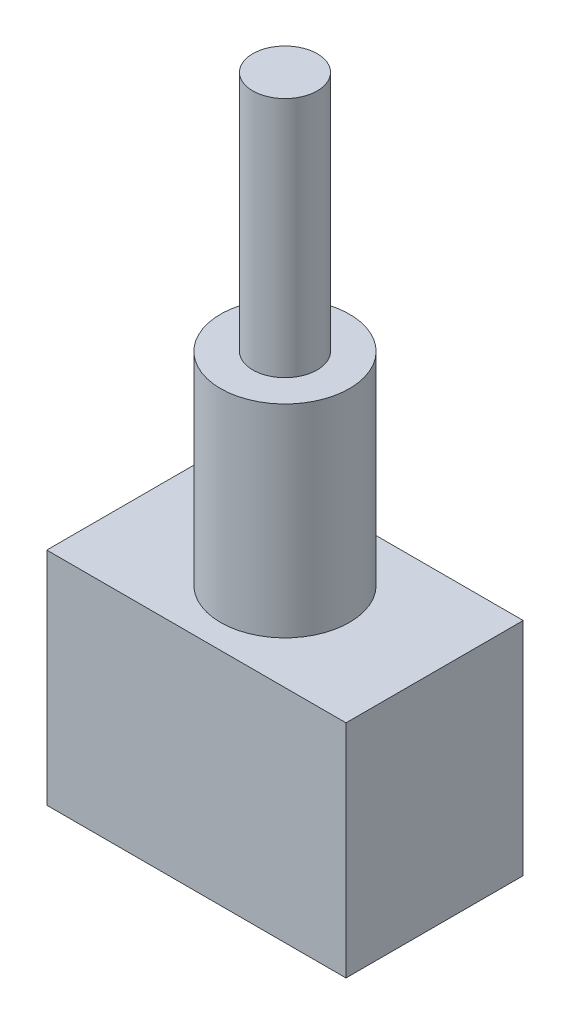
ISO-10303-21;
HEADER;
FILE_DESCRIPTION(('STEP AP214'),'2;1');
FILE_NAME('part.step','',(''),(''),'','','');
FILE_SCHEMA(('AUTOMOTIVE_DESIGN { 1 0 10303 214 1 1 1 1 }'));
ENDSEC;
DATA;
#1=APPLICATION_CONTEXT('core data for automotive mechanical design processes');
#2=APPLICATION_PROTOCOL_DEFINITION('international standard','automotive_design',2000,#1);
#3=PRODUCT_CONTEXT('',#1,'mechanical');
#4=PRODUCT('Part','Part','',(#3));
#5=PRODUCT_RELATED_PRODUCT_CATEGORY('part','',(#4));
#6=PRODUCT_DEFINITION_FORMATION('','',#4);
#7=PRODUCT_DEFINITION_CONTEXT('part definition',#1,'design');
#8=PRODUCT_DEFINITION('design','',#6,#7);
#9=PRODUCT_DEFINITION_SHAPE('','',#8);
#10=(LENGTH_UNIT() NAMED_UNIT(*) SI_UNIT(.MILLI.,.METRE.));
#11=(NAMED_UNIT(*) PLANE_ANGLE_UNIT() SI_UNIT($,.RADIAN.));
#12=(NAMED_UNIT(*) SI_UNIT($,.STERADIAN.) SOLID_ANGLE_UNIT());
#13=UNCERTAINTY_MEASURE_WITH_UNIT(LENGTH_MEASURE(1.E-05),#10,'distance_accuracy_value','');
#14=(GEOMETRIC_REPRESENTATION_CONTEXT(3) GLOBAL_UNCERTAINTY_ASSIGNED_CONTEXT((#13)) GLOBAL_UNIT_ASSIGNED_CONTEXT((#10,
#11,#12)) REPRESENTATION_CONTEXT('',''));
#15=CARTESIAN_POINT('',(0.,0.,0.));
#16=DIRECTION('',(0.,0.,1.));
#17=DIRECTION('',(1.,0.,0.));
#18=AXIS2_PLACEMENT_3D('',#15,#16,#17);
#19=CARTESIAN_POINT('',(0.,0.,7.7));
#20=DIRECTION('',(1.,0.,0.));
#21=DIRECTION('',(0.,0.,-1.));
#22=AXIS2_PLACEMENT_3D('',#19,#20,#21);
#23=PLANE('',#22);
#24=DIRECTION('',(0.,-1.,0.));
#25=VECTOR('',#24,1.);
#26=CARTESIAN_POINT('',(0.,0.,0.));
#27=LINE('',#26,#25);
#28=CARTESIAN_POINT('',(0.,9.6,0.));
#29=VERTEX_POINT('',#28);
#30=CARTESIAN_POINT('',(0.,0.,0.));
#31=VERTEX_POINT('',#30);
#32=EDGE_CURVE('E100',#29,#31,#27,.T.);
#33=ORIENTED_EDGE('',*,*,#32,.T.);
#34=DIRECTION('',(0.,0.,-1.));
#35=VECTOR('',#34,1.);
#36=CARTESIAN_POINT('',(0.,0.,7.7));
#37=LINE('',#36,#35);
#38=CARTESIAN_POINT('',(0.,0.,7.7));
#39=VERTEX_POINT('',#38);
#40=EDGE_CURVE('E36',#39,#31,#37,.T.);
#41=ORIENTED_EDGE('',*,*,#40,.F.);
#42=DIRECTION('',(0.,-1.,0.));
#43=VECTOR('',#42,1.);
#44=CARTESIAN_POINT('',(0.,0.,7.7));
#45=LINE('',#44,#43);
#46=CARTESIAN_POINT('',(0.,9.6,7.7));
#47=VERTEX_POINT('',#46);
#48=EDGE_CURVE('E87',#47,#39,#45,.T.);
#49=ORIENTED_EDGE('',*,*,#48,.F.);
#50=DIRECTION('',(0.,0.,-1.));
#51=VECTOR('',#50,1.);
#52=CARTESIAN_POINT('',(0.,9.6,7.7));
#53=LINE('',#52,#51);
#54=EDGE_CURVE('E96',#47,#29,#53,.T.);
#55=ORIENTED_EDGE('',*,*,#54,.T.);
#56=EDGE_LOOP('',(#33,#41,#49,#55));
#57=FACE_BOUND('',#56,.T.);
#58=ADVANCED_FACE('F33',(#57),#23,.F.);
#59=CARTESIAN_POINT('',(13.,0.,7.7));
#60=DIRECTION('',(0.,1.,0.));
#61=DIRECTION('',(-1.,0.,0.));
#62=AXIS2_PLACEMENT_3D('',#59,#60,#61);
#63=PLANE('',#62);
#64=DIRECTION('',(1.,0.,0.));
#65=VECTOR('',#64,1.);
#66=CARTESIAN_POINT('',(13.,0.,0.));
#67=LINE('',#66,#65);
#68=CARTESIAN_POINT('',(13.,0.,0.));
#69=VERTEX_POINT('',#68);
#70=EDGE_CURVE('E92',#31,#69,#67,.T.);
#71=ORIENTED_EDGE('',*,*,#70,.T.);
#72=DIRECTION('',(0.,0.,-1.));
#73=VECTOR('',#72,1.);
#74=CARTESIAN_POINT('',(13.,0.,7.7));
#75=LINE('',#74,#73);
#76=CARTESIAN_POINT('',(13.,0.,7.7));
#77=VERTEX_POINT('',#76);
#78=EDGE_CURVE('E90',#77,#69,#75,.T.);
#79=ORIENTED_EDGE('',*,*,#78,.F.);
#80=DIRECTION('',(1.,0.,0.));
#81=VECTOR('',#80,1.);
#82=CARTESIAN_POINT('',(13.,0.,7.7));
#83=LINE('',#82,#81);
#84=EDGE_CURVE('E82',#39,#77,#83,.T.);
#85=ORIENTED_EDGE('',*,*,#84,.F.);
#86=ORIENTED_EDGE('',*,*,#40,.T.);
#87=EDGE_LOOP('',(#71,#79,#85,#86));
#88=FACE_BOUND('',#87,.T.);
#89=ADVANCED_FACE('F91',(#88),#63,.F.);
#90=CARTESIAN_POINT('',(13.,9.6,7.7));
#91=DIRECTION('',(-1.,0.,0.));
#92=DIRECTION('',(0.,-1.,0.));
#93=AXIS2_PLACEMENT_3D('',#90,#91,#92);
#94=PLANE('',#93);
#95=DIRECTION('',(0.,1.,0.));
#96=VECTOR('',#95,1.);
#97=CARTESIAN_POINT('',(13.,9.6,0.));
#98=LINE('',#97,#96);
#99=CARTESIAN_POINT('',(13.,9.6,0.));
#100=VERTEX_POINT('',#99);
#101=EDGE_CURVE('E68',#69,#100,#98,.T.);
#102=ORIENTED_EDGE('',*,*,#101,.T.);
#103=DIRECTION('',(0.,0.,-1.));
#104=VECTOR('',#103,1.);
#105=CARTESIAN_POINT('',(13.,9.6,7.7));
#106=LINE('',#105,#104);
#107=CARTESIAN_POINT('',(13.,9.6,7.7));
#108=VERTEX_POINT('',#107);
#109=EDGE_CURVE('E93',#108,#100,#106,.T.);
#110=ORIENTED_EDGE('',*,*,#109,.F.);
#111=DIRECTION('',(0.,1.,0.));
#112=VECTOR('',#111,1.);
#113=CARTESIAN_POINT('',(13.,9.6,7.7));
#114=LINE('',#113,#112);
#115=EDGE_CURVE('E85',#77,#108,#114,.T.);
#116=ORIENTED_EDGE('',*,*,#115,.F.);
#117=ORIENTED_EDGE('',*,*,#78,.T.);
#118=EDGE_LOOP('',(#102,#110,#116,#117));
#119=FACE_BOUND('',#118,.T.);
#120=ADVANCED_FACE('F94',(#119),#94,.F.);
#121=CARTESIAN_POINT('',(0.,9.6,7.7));
#122=DIRECTION('',(0.,-1.,0.));
#123=DIRECTION('',(0.,0.,-1.));
#124=AXIS2_PLACEMENT_3D('',#121,#122,#123);
#125=PLANE('',#124);
#126=CARTESIAN_POINT('',(6.5,9.6,3.85));
#127=DIRECTION('',(0.,1.,0.));
#128=DIRECTION('',(0.,0.,1.));
#129=AXIS2_PLACEMENT_3D('',#126,#127,#128);
#130=CIRCLE('',#129,2.8);
#131=CARTESIAN_POINT('',(6.5,9.6,6.65));
#132=VERTEX_POINT('',#131);
#133=EDGE_CURVE('E42',#132,#132,#130,.T.);
#134=ORIENTED_EDGE('',*,*,#133,.F.);
#135=EDGE_LOOP('',(#134));
#136=FACE_BOUND('',#135,.T.);
#137=DIRECTION('',(-1.,0.,0.));
#138=VECTOR('',#137,1.);
#139=CARTESIAN_POINT('',(0.,9.6,0.));
#140=LINE('',#139,#138);
#141=EDGE_CURVE('E74',#100,#29,#140,.T.);
#142=ORIENTED_EDGE('',*,*,#141,.T.);
#143=ORIENTED_EDGE('',*,*,#54,.F.);
#144=DIRECTION('',(-1.,0.,0.));
#145=VECTOR('',#144,1.);
#146=CARTESIAN_POINT('',(0.,9.6,7.7));
#147=LINE('',#146,#145);
#148=EDGE_CURVE('E51',#108,#47,#147,.T.);
#149=ORIENTED_EDGE('',*,*,#148,.F.);
#150=ORIENTED_EDGE('',*,*,#109,.T.);
#151=EDGE_LOOP('',(#142,#143,#149,#150));
#152=FACE_BOUND('',#151,.T.);
#153=ADVANCED_FACE('F108',(#136,#152),#125,.F.);
#154=CARTESIAN_POINT('',(0.,0.,7.7));
#155=DIRECTION('',(0.,0.,-1.));
#156=DIRECTION('',(-1.,0.,0.));
#157=AXIS2_PLACEMENT_3D('',#154,#155,#156);
#158=PLANE('',#157);
#159=ORIENTED_EDGE('',*,*,#48,.T.);
#160=ORIENTED_EDGE('',*,*,#84,.T.);
#161=ORIENTED_EDGE('',*,*,#115,.T.);
#162=ORIENTED_EDGE('',*,*,#148,.T.);
#163=EDGE_LOOP('',(#159,#160,#161,#162));
#164=FACE_BOUND('',#163,.T.);
#165=ADVANCED_FACE('F83',(#164),#158,.F.);
#166=CARTESIAN_POINT('',(0.,0.,0.));
#167=DIRECTION('',(0.,0.,-1.));
#168=DIRECTION('',(-1.,0.,0.));
#169=AXIS2_PLACEMENT_3D('',#166,#167,#168);
#170=PLANE('',#169);
#171=ORIENTED_EDGE('',*,*,#32,.F.);
#172=ORIENTED_EDGE('',*,*,#141,.F.);
#173=ORIENTED_EDGE('',*,*,#101,.F.);
#174=ORIENTED_EDGE('',*,*,#70,.F.);
#175=EDGE_LOOP('',(#171,#172,#173,#174));
#176=FACE_BOUND('',#175,.T.);
#177=ADVANCED_FACE('F111',(#176),#170,.T.);
#178=CARTESIAN_POINT('',(6.5,18.4,3.85));
#179=DIRECTION('',(0.,-1.,0.));
#180=DIRECTION('',(0.,0.,-1.));
#181=AXIS2_PLACEMENT_3D('',#178,#179,#180);
#182=CYLINDRICAL_SURFACE('',#181,2.8);
#183=CARTESIAN_POINT('',(6.5,18.4,3.85));
#184=DIRECTION('',(0.,1.,0.));
#185=DIRECTION('',(0.,0.,1.));
#186=AXIS2_PLACEMENT_3D('',#183,#184,#185);
#187=CIRCLE('',#186,2.8);
#188=CARTESIAN_POINT('',(6.5,18.4,6.65));
#189=VERTEX_POINT('',#188);
#190=EDGE_CURVE('E103',#189,#189,#187,.T.);
#191=ORIENTED_EDGE('',*,*,#190,.F.);
#192=EDGE_LOOP('',(#191));
#193=FACE_BOUND('',#192,.T.);
#194=ORIENTED_EDGE('',*,*,#133,.T.);
#195=EDGE_LOOP('',(#194));
#196=FACE_BOUND('',#195,.T.);
#197=ADVANCED_FACE('F133',(#193,#196),#182,.T.);
#198=CARTESIAN_POINT('',(6.5,18.4,3.85));
#199=DIRECTION('',(0.,1.,0.));
#200=DIRECTION('',(0.,0.,1.));
#201=AXIS2_PLACEMENT_3D('',#198,#199,#200);
#202=PLANE('',#201);
#203=CARTESIAN_POINT('',(6.5,18.4,3.85));
#204=DIRECTION('',(0.,1.,0.));
#205=DIRECTION('',(0.,0.,1.));
#206=AXIS2_PLACEMENT_3D('',#203,#204,#205);
#207=CIRCLE('',#206,1.4);
#208=CARTESIAN_POINT('',(6.5,18.4,2.45));
#209=VERTEX_POINT('',#208);
#210=EDGE_CURVE('E11',#209,#209,#207,.T.);
#211=ORIENTED_EDGE('',*,*,#210,.F.);
#212=EDGE_LOOP('',(#211));
#213=FACE_BOUND('',#212,.T.);
#214=ORIENTED_EDGE('',*,*,#190,.T.);
#215=EDGE_LOOP('',(#214));
#216=FACE_BOUND('',#215,.T.);
#217=ADVANCED_FACE('F127',(#213,#216),#202,.T.);
#218=CARTESIAN_POINT('',(6.5,28.9,3.85));
#219=DIRECTION('',(0.,-1.,0.));
#220=DIRECTION('',(0.,0.,-1.));
#221=AXIS2_PLACEMENT_3D('',#218,#219,#220);
#222=CYLINDRICAL_SURFACE('',#221,1.4);
#223=CARTESIAN_POINT('',(6.5,28.9,3.85));
#224=DIRECTION('',(0.,1.,0.));
#225=DIRECTION('',(0.,0.,1.));
#226=AXIS2_PLACEMENT_3D('',#223,#224,#225);
#227=CIRCLE('',#226,1.4);
#228=CARTESIAN_POINT('',(6.5,28.9,2.45));
#229=VERTEX_POINT('',#228);
#230=EDGE_CURVE('E117',#229,#229,#227,.T.);
#231=CARTESIAN_POINT('',(6.5,28.9,2.45));
#232=CARTESIAN_POINT('',(6.5,28.790625,2.45));
#233=CARTESIAN_POINT('',(6.5,28.68125,2.45));
#234=CARTESIAN_POINT('',(6.5,28.4625,2.45));
#235=CARTESIAN_POINT('',(6.5,28.353125,2.45));
#236=CARTESIAN_POINT('',(6.5,28.134375,2.45));
#237=CARTESIAN_POINT('',(6.5,28.025,2.45));
#238=CARTESIAN_POINT('',(6.5,27.80625,2.45));
#239=CARTESIAN_POINT('',(6.5,27.696875,2.45));
#240=CARTESIAN_POINT('',(6.5,27.478125,2.45));
#241=CARTESIAN_POINT('',(6.5,27.36875,2.45));
#242=CARTESIAN_POINT('',(6.5,27.15,2.45));
#243=CARTESIAN_POINT('',(6.5,27.040625,2.45));
#244=CARTESIAN_POINT('',(6.5,26.821875,2.45));
#245=CARTESIAN_POINT('',(6.5,26.7125,2.45));
#246=CARTESIAN_POINT('',(6.5,26.49375,2.45));
#247=CARTESIAN_POINT('',(6.5,26.384375,2.45));
#248=CARTESIAN_POINT('',(6.5,26.165625,2.45));
#249=CARTESIAN_POINT('',(6.5,26.05625,2.45));
#250=CARTESIAN_POINT('',(6.5,25.8375,2.45));
#251=CARTESIAN_POINT('',(6.5,25.728125,2.45));
#252=CARTESIAN_POINT('',(6.5,25.509375,2.45));
#253=CARTESIAN_POINT('',(6.5,25.4,2.45));
#254=CARTESIAN_POINT('',(6.5,25.18125,2.45));
#255=CARTESIAN_POINT('',(6.5,25.071875,2.45));
#256=CARTESIAN_POINT('',(6.5,24.853125,2.45));
#257=CARTESIAN_POINT('',(6.5,24.74375,2.45));
#258=CARTESIAN_POINT('',(6.5,24.525,2.45));
#259=CARTESIAN_POINT('',(6.5,24.415625,2.45));
#260=CARTESIAN_POINT('',(6.5,24.196875,2.45));
#261=CARTESIAN_POINT('',(6.5,24.0875,2.45));
#262=CARTESIAN_POINT('',(6.5,23.86875,2.45));
#263=CARTESIAN_POINT('',(6.5,23.759375,2.45));
#264=CARTESIAN_POINT('',(6.5,23.540625,2.45));
#265=CARTESIAN_POINT('',(6.5,23.43125,2.45));
#266=CARTESIAN_POINT('',(6.5,23.2125,2.45));
#267=CARTESIAN_POINT('',(6.5,23.103125,2.45));
#268=CARTESIAN_POINT('',(6.5,22.884375,2.45));
#269=CARTESIAN_POINT('',(6.5,22.775,2.45));
#270=CARTESIAN_POINT('',(6.5,22.55625,2.45));
#271=CARTESIAN_POINT('',(6.5,22.446875,2.45));
#272=CARTESIAN_POINT('',(6.5,22.228125,2.45));
#273=CARTESIAN_POINT('',(6.5,22.11875,2.45));
#274=CARTESIAN_POINT('',(6.5,21.9,2.45));
#275=CARTESIAN_POINT('',(6.5,21.790625,2.45));
#276=CARTESIAN_POINT('',(6.5,21.571875,2.45));
#277=CARTESIAN_POINT('',(6.5,21.4625,2.45));
#278=CARTESIAN_POINT('',(6.5,21.24375,2.45));
#279=CARTESIAN_POINT('',(6.5,21.134375,2.45));
#280=CARTESIAN_POINT('',(6.5,20.915625,2.45));
#281=CARTESIAN_POINT('',(6.5,20.80625,2.45));
#282=CARTESIAN_POINT('',(6.5,20.5875,2.45));
#283=CARTESIAN_POINT('',(6.5,20.478125,2.45));
#284=CARTESIAN_POINT('',(6.5,20.259375,2.45));
#285=CARTESIAN_POINT('',(6.5,20.15,2.45));
#286=CARTESIAN_POINT('',(6.5,19.93125,2.45));
#287=CARTESIAN_POINT('',(6.5,19.821875,2.45));
#288=CARTESIAN_POINT('',(6.5,19.603125,2.45));
#289=CARTESIAN_POINT('',(6.5,19.49375,2.45));
#290=CARTESIAN_POINT('',(6.5,19.275,2.45));
#291=CARTESIAN_POINT('',(6.5,19.165625,2.45));
#292=CARTESIAN_POINT('',(6.5,18.946875,2.45));
#293=CARTESIAN_POINT('',(6.5,18.8375,2.45));
#294=CARTESIAN_POINT('',(6.5,18.61875,2.45));
#295=CARTESIAN_POINT('',(6.5,18.509375,2.45));
#296=CARTESIAN_POINT('',(6.5,18.4,2.45));
#297=B_SPLINE_CURVE_WITH_KNOTS('',3,(#231,#232,#233,#234,#235,#236,#237,#238,#239,#240,#241,
#242,#243,#244,#245,#246,#247,#248,#249,#250,#251,#252,#253,#254,#255,#256,#257,#258,#259,#260,
#261,#262,#263,#264,#265,#266,#267,#268,#269,#270,#271,#272,#273,#274,#275,#276,#277,#278,#279,
#280,#281,#282,#283,#284,#285,#286,#287,#288,#289,#290,#291,#292,#293,#294,#295,#296),
.UNSPECIFIED.,.F.,.F.,(4,2,2,2,2,2,2,2,2,2,2,2,2,2,2,2,2,2,2,2,2,2,2,2,2,2,2,2,2,2,2,2,4),(0.,
0.328125000000002,0.656250000000001,0.984375000000003,1.3125,1.640625,1.96875,2.296875,2.625,
2.953125,3.28125,3.609375,3.9375,4.265625,4.59375,4.921875,5.25,5.578125,5.90625,6.234375,
6.5625,6.890625,7.21875,7.54687500000001,7.875,8.20312500000001,8.53125,8.859375,9.1875,
9.515625,9.84375000000001,10.171875,10.5),.UNSPECIFIED.);
#298=EDGE_CURVE('BSEAM124',#229,#209,#297,.T.);
#299=ORIENTED_EDGE('',*,*,#230,.F.);
#300=ORIENTED_EDGE('',*,*,#210,.T.);
#301=ORIENTED_EDGE('',*,*,#298,.T.);
#302=ORIENTED_EDGE('',*,*,#298,.F.);
#303=EDGE_LOOP('',(#299,#301,#300,#302));
#304=FACE_BOUND('',#303,.T.);
#305=ADVANCED_FACE('F124',(#304),#222,.T.);
#306=CARTESIAN_POINT('',(6.5,28.9,3.85));
#307=DIRECTION('',(0.,1.,0.));
#308=DIRECTION('',(0.,0.,1.));
#309=AXIS2_PLACEMENT_3D('',#306,#307,#308);
#310=PLANE('',#309);
#311=ORIENTED_EDGE('',*,*,#230,.T.);
#312=EDGE_LOOP('',(#311));
#313=FACE_BOUND('',#312,.T.);
#314=ADVANCED_FACE('F122',(#313),#310,.T.);
#315=CLOSED_SHELL('',(#58,#89,#120,#153,#165,#177,#197,#217,#305,#314));
#316=MANIFOLD_SOLID_BREP('B2',#315);
#317=ADVANCED_BREP_SHAPE_REPRESENTATION('',(#18,#316),#14);
#318=SHAPE_DEFINITION_REPRESENTATION(#9,#317);
ENDSEC;
END-ISO-10303-21;
